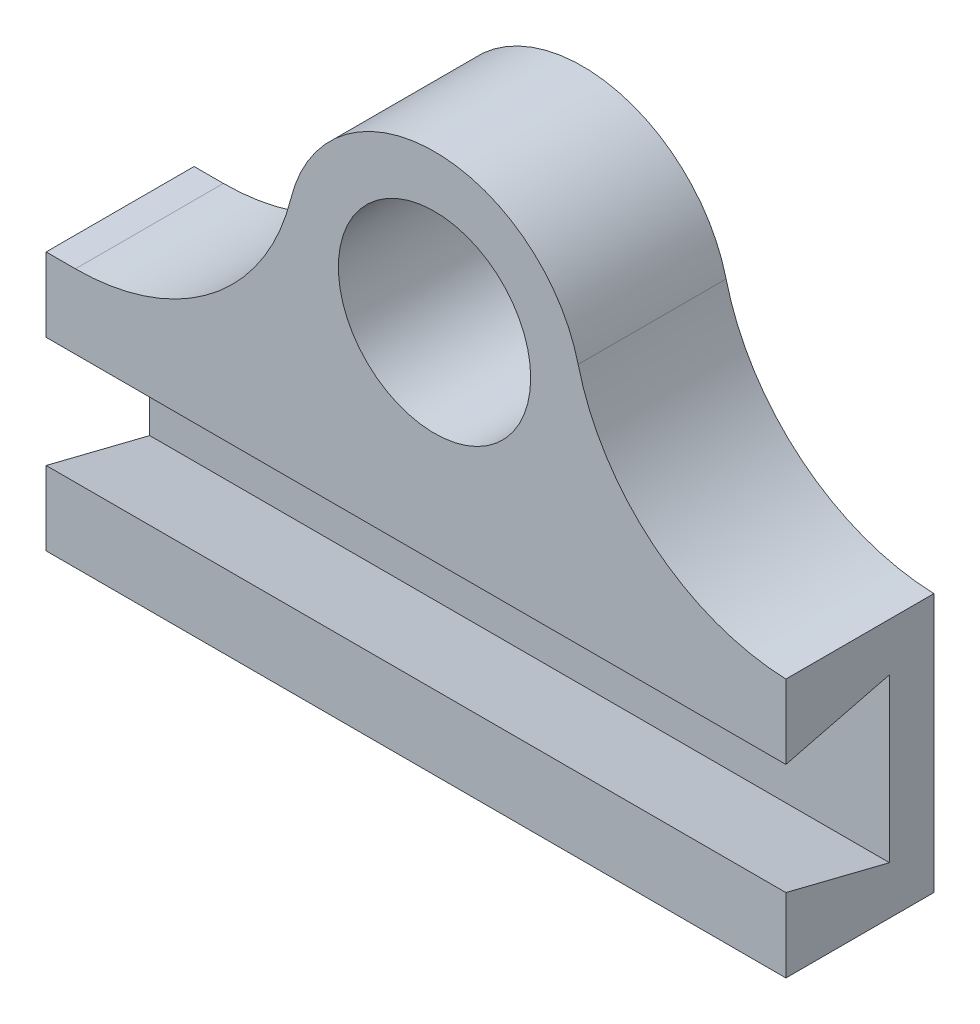
ISO-10303-21;
HEADER;
FILE_DESCRIPTION(('STEP AP214'),'2;1');
FILE_NAME('part.step','',(''),(''),'','','');
FILE_SCHEMA(('AUTOMOTIVE_DESIGN { 1 0 10303 214 1 1 1 1 }'));
ENDSEC;
DATA;
#1=APPLICATION_CONTEXT('core data for automotive mechanical design processes');
#2=APPLICATION_PROTOCOL_DEFINITION('international standard','automotive_design',2000,#1);
#3=PRODUCT_CONTEXT('',#1,'mechanical');
#4=PRODUCT('Part','Part','',(#3));
#5=PRODUCT_RELATED_PRODUCT_CATEGORY('part','',(#4));
#6=PRODUCT_DEFINITION_FORMATION('','',#4);
#7=PRODUCT_DEFINITION_CONTEXT('part definition',#1,'design');
#8=PRODUCT_DEFINITION('design','',#6,#7);
#9=PRODUCT_DEFINITION_SHAPE('','',#8);
#10=(LENGTH_UNIT() NAMED_UNIT(*) SI_UNIT(.MILLI.,.METRE.));
#11=(NAMED_UNIT(*) PLANE_ANGLE_UNIT() SI_UNIT($,.RADIAN.));
#12=(NAMED_UNIT(*) SI_UNIT($,.STERADIAN.) SOLID_ANGLE_UNIT());
#13=UNCERTAINTY_MEASURE_WITH_UNIT(LENGTH_MEASURE(1.E-05),#10,'distance_accuracy_value','');
#14=(GEOMETRIC_REPRESENTATION_CONTEXT(3) GLOBAL_UNCERTAINTY_ASSIGNED_CONTEXT((#13)) GLOBAL_UNIT_ASSIGNED_CONTEXT((#10,
#11,#12)) REPRESENTATION_CONTEXT('',''));
#15=CARTESIAN_POINT('',(0.,0.,0.));
#16=DIRECTION('',(0.,0.,1.));
#17=DIRECTION('',(1.,0.,0.));
#18=AXIS2_PLACEMENT_3D('',#15,#16,#17);
#19=CARTESIAN_POINT('',(-61.0134159180916,-22.5826380371425,2.));
#20=DIRECTION('',(0.,-1.,0.));
#21=DIRECTION('',(1.,0.,0.));
#22=AXIS2_PLACEMENT_3D('',#19,#20,#21);
#23=PLANE('',#22);
#24=DIRECTION('',(-1.,0.,0.));
#25=VECTOR('',#24,1.);
#26=CARTESIAN_POINT('',(-61.0134159180916,-22.5826380371425,2.));
#27=LINE('',#26,#25);
#28=CARTESIAN_POINT('',(-70.6172803578962,-22.5826380371425,2.));
#29=VERTEX_POINT('',#28);
#30=CARTESIAN_POINT('',(-71.0134159180916,-22.5826380371425,2.));
#31=VERTEX_POINT('',#30);
#32=EDGE_CURVE('E222',#29,#31,#27,.T.);
#33=ORIENTED_EDGE('',*,*,#32,.F.);
#34=DIRECTION('',(0.,0.,1.));
#35=VECTOR('',#34,1.);
#36=CARTESIAN_POINT('',(-70.6172803578962,-22.5826380371425,2.));
#37=LINE('',#36,#35);
#38=CARTESIAN_POINT('',(-70.6172803578962,-22.5826380371425,0.));
#39=VERTEX_POINT('',#38);
#40=EDGE_CURVE('E254',#29,#39,#37,.F.);
#41=ORIENTED_EDGE('',*,*,#40,.T.);
#42=DIRECTION('',(-1.,0.,0.));
#43=VECTOR('',#42,1.);
#44=CARTESIAN_POINT('',(-61.0134159180916,-22.5826380371425,0.));
#45=LINE('',#44,#43);
#46=CARTESIAN_POINT('',(-71.0134159180916,-22.5826380371425,0.));
#47=VERTEX_POINT('',#46);
#48=EDGE_CURVE('E235',#39,#47,#45,.T.);
#49=ORIENTED_EDGE('',*,*,#48,.T.);
#50=DIRECTION('',(0.,0.,-1.));
#51=VECTOR('',#50,1.);
#52=CARTESIAN_POINT('',(-71.0134159180916,-22.5826380371425,2.));
#53=LINE('',#52,#51);
#54=EDGE_CURVE('E240',#31,#47,#53,.T.);
#55=ORIENTED_EDGE('',*,*,#54,.F.);
#56=EDGE_LOOP('',(#33,#41,#49,#55));
#57=FACE_BOUND('',#56,.T.);
#58=ADVANCED_FACE('F34',(#57),#23,.F.);
#59=CARTESIAN_POINT('',(0.,0.,0.));
#60=DIRECTION('',(0.,0.,-1.));
#61=DIRECTION('',(-1.,0.,0.));
#62=AXIS2_PLACEMENT_3D('',#59,#60,#61);
#63=PLANE('',#62);
#64=CARTESIAN_POINT('',(-67.5134159180916,-22.5826380371425,0.));
#65=VERTEX_POINT('',#64);
#66=EDGE_CURVE('E49',#65,#39,#45,.T.);
#67=ORIENTED_EDGE('',*,*,#66,.F.);
#68=DIRECTION('',(0.,-1.,0.));
#69=VECTOR('',#68,1.);
#70=CARTESIAN_POINT('',(-67.5134159180916,-22.5826380371425,0.));
#71=LINE('',#70,#69);
#72=CARTESIAN_POINT('',(-67.5134159180916,-26.0826380371425,0.));
#73=VERTEX_POINT('',#72);
#74=EDGE_CURVE('E158',#65,#73,#71,.T.);
#75=ORIENTED_EDGE('',*,*,#74,.T.);
#76=DIRECTION('',(1.,0.,0.));
#77=VECTOR('',#76,1.);
#78=CARTESIAN_POINT('',(-61.0134159180916,-26.0826380371425,0.));
#79=LINE('',#78,#77);
#80=CARTESIAN_POINT('',(-71.0134159180916,-26.0826380371425,0.));
#81=VERTEX_POINT('',#80);
#82=EDGE_CURVE('E229',#81,#73,#79,.T.);
#83=ORIENTED_EDGE('',*,*,#82,.F.);
#84=DIRECTION('',(0.,-1.,0.));
#85=VECTOR('',#84,1.);
#86=CARTESIAN_POINT('',(-71.0134159180916,-26.0826380371425,0.));
#87=LINE('',#86,#85);
#88=EDGE_CURVE('E218',#47,#81,#87,.T.);
#89=ORIENTED_EDGE('',*,*,#88,.F.);
#90=ORIENTED_EDGE('',*,*,#48,.F.);
#91=EDGE_LOOP('',(#67,#75,#83,#89,#90));
#92=FACE_BOUND('',#91,.T.);
#93=ADVANCED_FACE('F284',(#92),#63,.T.);
#94=CARTESIAN_POINT('',(0.,0.,2.));
#95=DIRECTION('',(0.,0.,-1.));
#96=DIRECTION('',(-1.,0.,0.));
#97=AXIS2_PLACEMENT_3D('',#94,#95,#96);
#98=PLANE('',#97);
#99=DIRECTION('',(0.,1.,0.));
#100=VECTOR('',#99,1.);
#101=CARTESIAN_POINT('',(-61.0134159180916,-26.0826380371425,2.));
#102=LINE('',#101,#100);
#103=CARTESIAN_POINT('',(-61.0134159180916,-26.0826380371425,2.));
#104=VERTEX_POINT('',#103);
#105=CARTESIAN_POINT('',(-61.0134159180916,-25.0826380371425,2.));
#106=VERTEX_POINT('',#105);
#107=EDGE_CURVE('E219',#104,#106,#102,.T.);
#108=ORIENTED_EDGE('',*,*,#107,.T.);
#109=DIRECTION('',(-1.,0.,0.));
#110=VECTOR('',#109,1.);
#111=CARTESIAN_POINT('',(-61.0134159180916,-25.0826380371425,2.));
#112=LINE('',#111,#110);
#113=CARTESIAN_POINT('',(-71.0134159180916,-25.0826380371425,2.));
#114=VERTEX_POINT('',#113);
#115=EDGE_CURVE('E199',#106,#114,#112,.T.);
#116=ORIENTED_EDGE('',*,*,#115,.T.);
#117=DIRECTION('',(0.,-1.,0.));
#118=VECTOR('',#117,1.);
#119=CARTESIAN_POINT('',(-71.0134159180916,-26.0826380371425,2.));
#120=LINE('',#119,#118);
#121=CARTESIAN_POINT('',(-71.0134159180916,-26.0826380371425,2.));
#122=VERTEX_POINT('',#121);
#123=EDGE_CURVE('E224',#114,#122,#120,.T.);
#124=ORIENTED_EDGE('',*,*,#123,.T.);
#125=DIRECTION('',(1.,0.,0.));
#126=VECTOR('',#125,1.);
#127=CARTESIAN_POINT('',(-61.0134159180916,-26.0826380371425,2.));
#128=LINE('',#127,#126);
#129=EDGE_CURVE('E214',#122,#104,#128,.T.);
#130=ORIENTED_EDGE('',*,*,#129,.T.);
#131=EDGE_LOOP('',(#108,#116,#124,#130));
#132=FACE_BOUND('',#131,.T.);
#133=ADVANCED_FACE('F310',(#132),#98,.F.);
#134=CARTESIAN_POINT('',(-61.0134159180916,-26.0826380371425,2.));
#135=DIRECTION('',(0.,1.,0.));
#136=DIRECTION('',(-1.,0.,0.));
#137=AXIS2_PLACEMENT_3D('',#134,#135,#136);
#138=PLANE('',#137);
#139=ORIENTED_EDGE('',*,*,#82,.T.);
#140=DIRECTION('',(-0.263117405792104,0.,-0.964763821237733));
#141=VECTOR('',#140,1.);
#142=CARTESIAN_POINT('',(-67.8134159180916,-26.0826380371425,-1.1));
#143=LINE('',#142,#141);
#144=CARTESIAN_POINT('',(-67.8134159180916,-26.0826380371425,-1.1));
#145=VERTEX_POINT('',#144);
#146=EDGE_CURVE('E165',#73,#145,#143,.T.);
#147=ORIENTED_EDGE('',*,*,#146,.T.);
#148=DIRECTION('',(1.,0.,0.));
#149=VECTOR('',#148,1.);
#150=CARTESIAN_POINT('',(-66.2134159180916,-26.0826380371425,-1.1));
#151=LINE('',#150,#149);
#152=CARTESIAN_POINT('',(-66.2134159180916,-26.0826380371425,-1.1));
#153=VERTEX_POINT('',#152);
#154=EDGE_CURVE('E169',#145,#153,#151,.T.);
#155=ORIENTED_EDGE('',*,*,#154,.T.);
#156=DIRECTION('',(-0.263117405792104,0.,0.964763821237733));
#157=VECTOR('',#156,1.);
#158=CARTESIAN_POINT('',(-66.5134159180916,-26.0826380371425,0.));
#159=LINE('',#158,#157);
#160=CARTESIAN_POINT('',(-66.5134159180916,-26.0826380371425,0.));
#161=VERTEX_POINT('',#160);
#162=EDGE_CURVE('E179',#153,#161,#159,.T.);
#163=ORIENTED_EDGE('',*,*,#162,.T.);
#164=CARTESIAN_POINT('',(-61.0134159180916,-26.0826380371425,0.));
#165=VERTEX_POINT('',#164);
#166=EDGE_CURVE('E145',#161,#165,#79,.T.);
#167=ORIENTED_EDGE('',*,*,#166,.T.);
#168=DIRECTION('',(0.,0.,-1.));
#169=VECTOR('',#168,1.);
#170=CARTESIAN_POINT('',(-61.0134159180916,-26.0826380371425,2.));
#171=LINE('',#170,#169);
#172=EDGE_CURVE('E246',#104,#165,#171,.T.);
#173=ORIENTED_EDGE('',*,*,#172,.F.);
#174=ORIENTED_EDGE('',*,*,#129,.F.);
#175=DIRECTION('',(0.,0.,-1.));
#176=VECTOR('',#175,1.);
#177=CARTESIAN_POINT('',(-71.0134159180916,-26.0826380371425,2.));
#178=LINE('',#177,#176);
#179=EDGE_CURVE('E228',#122,#81,#178,.T.);
#180=ORIENTED_EDGE('',*,*,#179,.T.);
#181=EDGE_LOOP('',(#139,#147,#155,#163,#167,#173,#174,#180));
#182=FACE_BOUND('',#181,.T.);
#183=ADVANCED_FACE('F276',(#182),#138,.F.);
#184=CARTESIAN_POINT('',(-61.0134159180916,-26.0826380371425,2.));
#185=DIRECTION('',(-1.,0.,0.));
#186=DIRECTION('',(0.,0.,1.));
#187=AXIS2_PLACEMENT_3D('',#184,#185,#186);
#188=PLANE('',#187);
#189=DIRECTION('',(0.,-1.,0.));
#190=VECTOR('',#189,1.);
#191=CARTESIAN_POINT('',(-61.0134159180916,-25.4326380371425,0.6));
#192=LINE('',#191,#190);
#193=CARTESIAN_POINT('',(-61.0134159180916,-23.2326380371425,0.599999999999999));
#194=VERTEX_POINT('',#193);
#195=CARTESIAN_POINT('',(-61.0134159180916,-25.4326380371425,0.6));
#196=VERTEX_POINT('',#195);
#197=EDGE_CURVE('E196',#194,#196,#192,.T.);
#198=ORIENTED_EDGE('',*,*,#197,.T.);
#199=DIRECTION('',(0.,0.242535625036333,0.970142500145332));
#200=VECTOR('',#199,1.);
#201=CARTESIAN_POINT('',(-61.0134159180916,-25.0826380371425,2.));
#202=LINE('',#201,#200);
#203=EDGE_CURVE('E189',#196,#106,#202,.T.);
#204=ORIENTED_EDGE('',*,*,#203,.T.);
#205=ORIENTED_EDGE('',*,*,#107,.F.);
#206=ORIENTED_EDGE('',*,*,#172,.T.);
#207=DIRECTION('',(0.,1.,0.));
#208=VECTOR('',#207,1.);
#209=CARTESIAN_POINT('',(-61.0134159180916,-26.0826380371425,0.));
#210=LINE('',#209,#208);
#211=CARTESIAN_POINT('',(-61.0134159180916,-22.5826380371425,0.));
#212=VERTEX_POINT('',#211);
#213=EDGE_CURVE('E232',#165,#212,#210,.T.);
#214=ORIENTED_EDGE('',*,*,#213,.T.);
#215=DIRECTION('',(0.,0.,-1.));
#216=VECTOR('',#215,1.);
#217=CARTESIAN_POINT('',(-61.0134159180916,-22.5826380371425,2.));
#218=LINE('',#217,#216);
#219=CARTESIAN_POINT('',(-61.0134159180916,-22.5826380371425,2.));
#220=VERTEX_POINT('',#219);
#221=EDGE_CURVE('E243',#220,#212,#218,.T.);
#222=ORIENTED_EDGE('',*,*,#221,.F.);
#223=CARTESIAN_POINT('',(-61.0134159180916,-23.5826380371425,2.));
#224=VERTEX_POINT('',#223);
#225=EDGE_CURVE('E217',#224,#220,#102,.T.);
#226=ORIENTED_EDGE('',*,*,#225,.F.);
#227=DIRECTION('',(0.,0.242535625036333,-0.970142500145332));
#228=VECTOR('',#227,1.);
#229=CARTESIAN_POINT('',(-61.0134159180916,-23.2326380371425,0.599999999999999));
#230=LINE('',#229,#228);
#231=EDGE_CURVE('E192',#224,#194,#230,.T.);
#232=ORIENTED_EDGE('',*,*,#231,.T.);
#233=EDGE_LOOP('',(#198,#204,#205,#206,#214,#222,#226,#232));
#234=FACE_BOUND('',#233,.T.);
#235=ADVANCED_FACE('F272',(#234),#188,.F.);
#236=DIRECTION('',(-0.263117405792104,0.,-0.964763821237733));
#237=VECTOR('',#236,1.);
#238=CARTESIAN_POINT('',(-67.8134159180916,-22.5826380371425,-1.1));
#239=LINE('',#238,#237);
#240=CARTESIAN_POINT('',(-67.8134159180916,-22.5826380371425,-1.1));
#241=VERTEX_POINT('',#240);
#242=EDGE_CURVE('E164',#65,#241,#239,.T.);
#243=ORIENTED_EDGE('',*,*,#242,.F.);
#244=DIRECTION('',(1.,0.,0.));
#245=VECTOR('',#244,1.);
#246=CARTESIAN_POINT('',(-64.8916361293835,-22.5826380371425,0.));
#247=LINE('',#246,#245);
#248=CARTESIAN_POINT('',(-66.5134159180916,-22.5826380371425,0.));
#249=VERTEX_POINT('',#248);
#250=EDGE_CURVE('E142',#65,#249,#247,.T.);
#251=ORIENTED_EDGE('',*,*,#250,.T.);
#252=DIRECTION('',(-0.263117405792104,0.,0.964763821237733));
#253=VECTOR('',#252,1.);
#254=CARTESIAN_POINT('',(-66.5134159180916,-22.5826380371425,0.));
#255=LINE('',#254,#253);
#256=CARTESIAN_POINT('',(-66.2134159180916,-22.5826380371425,-1.1));
#257=VERTEX_POINT('',#256);
#258=EDGE_CURVE('E153',#257,#249,#255,.T.);
#259=ORIENTED_EDGE('',*,*,#258,.F.);
#260=DIRECTION('',(1.,0.,0.));
#261=VECTOR('',#260,1.);
#262=CARTESIAN_POINT('',(-66.2134159180916,-22.5826380371425,-1.1));
#263=LINE('',#262,#261);
#264=EDGE_CURVE('E159',#241,#257,#263,.T.);
#265=ORIENTED_EDGE('',*,*,#264,.F.);
#266=EDGE_LOOP('',(#243,#251,#259,#265));
#267=FACE_BOUND('',#266,.T.);
#268=ADVANCED_FACE('F162',(#267),#23,.F.);
#269=CARTESIAN_POINT('',(-71.0134159180916,-26.0826380371425,2.));
#270=DIRECTION('',(1.,0.,0.));
#271=DIRECTION('',(0.,0.,-1.));
#272=AXIS2_PLACEMENT_3D('',#269,#270,#271);
#273=PLANE('',#272);
#274=ORIENTED_EDGE('',*,*,#123,.F.);
#275=DIRECTION('',(0.,0.242535625036333,0.970142500145332));
#276=VECTOR('',#275,1.);
#277=CARTESIAN_POINT('',(-71.0134159180916,-25.0826380371425,2.));
#278=LINE('',#277,#276);
#279=CARTESIAN_POINT('',(-71.0134159180916,-25.4326380371425,0.6));
#280=VERTEX_POINT('',#279);
#281=EDGE_CURVE('E149',#280,#114,#278,.T.);
#282=ORIENTED_EDGE('',*,*,#281,.F.);
#283=DIRECTION('',(0.,-1.,0.));
#284=VECTOR('',#283,1.);
#285=CARTESIAN_POINT('',(-71.0134159180916,-25.4326380371425,0.6));
#286=LINE('',#285,#284);
#287=CARTESIAN_POINT('',(-71.0134159180916,-23.2326380371425,0.599999999999999));
#288=VERTEX_POINT('',#287);
#289=EDGE_CURVE('E193',#288,#280,#286,.T.);
#290=ORIENTED_EDGE('',*,*,#289,.F.);
#291=DIRECTION('',(0.,0.242535625036333,-0.970142500145332));
#292=VECTOR('',#291,1.);
#293=CARTESIAN_POINT('',(-71.0134159180916,-23.2326380371425,0.599999999999999));
#294=LINE('',#293,#292);
#295=CARTESIAN_POINT('',(-71.0134159180916,-23.5826380371425,2.));
#296=VERTEX_POINT('',#295);
#297=EDGE_CURVE('E201',#296,#288,#294,.T.);
#298=ORIENTED_EDGE('',*,*,#297,.F.);
#299=EDGE_CURVE('E225',#31,#296,#120,.T.);
#300=ORIENTED_EDGE('',*,*,#299,.F.);
#301=ORIENTED_EDGE('',*,*,#54,.T.);
#302=ORIENTED_EDGE('',*,*,#88,.T.);
#303=ORIENTED_EDGE('',*,*,#179,.F.);
#304=EDGE_LOOP('',(#274,#282,#290,#298,#300,#301,#302,#303));
#305=FACE_BOUND('',#304,.T.);
#306=ADVANCED_FACE('F290',(#305),#273,.F.);
#307=CARTESIAN_POINT('',(-65.7634159180916,-20.7826380371425,2.));
#308=DIRECTION('',(0.,0.,1.));
#309=DIRECTION('',(1.,0.,0.));
#310=AXIS2_PLACEMENT_3D('',#307,#308,#309);
#311=CIRCLE('',#310,1.29999999999999);
#312=CARTESIAN_POINT('',(-64.4634159180916,-20.7826380371425,2.));
#313=VERTEX_POINT('',#312);
#314=EDGE_CURVE('E177',#313,#313,#311,.T.);
#315=ORIENTED_EDGE('',*,*,#314,.F.);
#316=EDGE_LOOP('',(#315));
#317=FACE_BOUND('',#316,.T.);
#318=ORIENTED_EDGE('',*,*,#299,.T.);
#319=DIRECTION('',(-1.,0.,0.));
#320=VECTOR('',#319,1.);
#321=CARTESIAN_POINT('',(-61.0134159180916,-23.5826380371425,2.));
#322=LINE('',#321,#320);
#323=EDGE_CURVE('E210',#224,#296,#322,.T.);
#324=ORIENTED_EDGE('',*,*,#323,.F.);
#325=ORIENTED_EDGE('',*,*,#225,.T.);
#326=CARTESIAN_POINT('',(-60.9091033539989,-19.5844521041203,2.));
#327=DIRECTION('',(0.,0.,-1.));
#328=DIRECTION('',(-1.,0.,0.));
#329=AXIS2_PLACEMENT_3D('',#326,#327,#328);
#330=CIRCLE('',#329,3.);
#331=CARTESIAN_POINT('',(-63.8216908924545,-20.3033636639336,2.));
#332=VERTEX_POINT('',#331);
#333=EDGE_CURVE('E42',#220,#332,#330,.T.);
#334=ORIENTED_EDGE('',*,*,#333,.T.);
#335=CARTESIAN_POINT('',(-65.7634159180916,-20.7826380371425,2.));
#336=DIRECTION('',(0.,0.,1.));
#337=DIRECTION('',(1.,0.,0.));
#338=AXIS2_PLACEMENT_3D('',#335,#336,#337);
#339=CIRCLE('',#338,2.);
#340=CARTESIAN_POINT('',(-67.7049616940134,-20.3026380371425,2.));
#341=VERTEX_POINT('',#340);
#342=EDGE_CURVE('E172',#332,#341,#339,.T.);
#343=ORIENTED_EDGE('',*,*,#342,.T.);
#344=CARTESIAN_POINT('',(-70.6172803578962,-19.5826380371425,2.));
#345=DIRECTION('',(0.,0.,-1.));
#346=DIRECTION('',(-1.,0.,0.));
#347=AXIS2_PLACEMENT_3D('',#344,#345,#346);
#348=CIRCLE('',#347,3.);
#349=EDGE_CURVE('E57',#341,#29,#348,.T.);
#350=ORIENTED_EDGE('',*,*,#349,.T.);
#351=ORIENTED_EDGE('',*,*,#32,.T.);
#352=EDGE_LOOP('',(#318,#324,#325,#334,#343,#350,#351));
#353=FACE_BOUND('',#352,.T.);
#354=ADVANCED_FACE('F260',(#317,#353),#98,.F.);
#355=CARTESIAN_POINT('',(-65.7634159180916,-20.7826380371425,0.));
#356=DIRECTION('',(0.,0.,-1.));
#357=DIRECTION('',(-1.,0.,0.));
#358=AXIS2_PLACEMENT_3D('',#355,#356,#357);
#359=CIRCLE('',#358,1.29999999999999);
#360=CARTESIAN_POINT('',(-67.0634159180916,-20.7826380371425,0.));
#361=VERTEX_POINT('',#360);
#362=EDGE_CURVE('E367',#361,#361,#359,.F.);
#363=ORIENTED_EDGE('',*,*,#362,.T.);
#364=EDGE_LOOP('',(#363));
#365=FACE_BOUND('',#364,.T.);
#366=DIRECTION('',(0.,-1.,0.));
#367=VECTOR('',#366,1.);
#368=CARTESIAN_POINT('',(-66.5134159180916,-22.5826380371425,0.));
#369=LINE('',#368,#367);
#370=EDGE_CURVE('E138',#249,#161,#369,.T.);
#371=ORIENTED_EDGE('',*,*,#370,.F.);
#372=ORIENTED_EDGE('',*,*,#250,.F.);
#373=ORIENTED_EDGE('',*,*,#66,.T.);
#374=CARTESIAN_POINT('',(-70.6172803578962,-19.5826380371425,0.));
#375=DIRECTION('',(0.,0.,-1.));
#376=DIRECTION('',(-1.,0.,0.));
#377=AXIS2_PLACEMENT_3D('',#374,#375,#376);
#378=CIRCLE('',#377,3.);
#379=CARTESIAN_POINT('',(-67.7049616940134,-20.3026380371425,0.));
#380=VERTEX_POINT('',#379);
#381=EDGE_CURVE('E257',#39,#380,#378,.F.);
#382=ORIENTED_EDGE('',*,*,#381,.T.);
#383=CARTESIAN_POINT('',(-65.7634159180916,-20.7826380371425,0.));
#384=DIRECTION('',(0.,0.,1.));
#385=DIRECTION('',(1.,0.,0.));
#386=AXIS2_PLACEMENT_3D('',#383,#384,#385);
#387=CIRCLE('',#386,2.);
#388=CARTESIAN_POINT('',(-63.8216908924545,-20.3033636639336,0.));
#389=VERTEX_POINT('',#388);
#390=EDGE_CURVE('E166',#389,#380,#387,.T.);
#391=ORIENTED_EDGE('',*,*,#390,.F.);
#392=CARTESIAN_POINT('',(-60.9091033539989,-19.5844521041203,0.));
#393=DIRECTION('',(0.,0.,-1.));
#394=DIRECTION('',(-1.,0.,0.));
#395=AXIS2_PLACEMENT_3D('',#392,#393,#394);
#396=CIRCLE('',#395,3.);
#397=EDGE_CURVE('E11',#389,#212,#396,.F.);
#398=ORIENTED_EDGE('',*,*,#397,.T.);
#399=ORIENTED_EDGE('',*,*,#213,.F.);
#400=ORIENTED_EDGE('',*,*,#166,.F.);
#401=EDGE_LOOP('',(#371,#372,#373,#382,#391,#398,#399,#400));
#402=FACE_BOUND('',#401,.T.);
#403=ADVANCED_FACE('F140',(#365,#402),#63,.T.);
#404=CARTESIAN_POINT('',(-61.0134159180916,-25.0826380371425,2.));
#405=DIRECTION('',(0.,-0.970142500145332,0.242535625036333));
#406=DIRECTION('',(0.,-0.242535625036333,-0.970142500145332));
#407=AXIS2_PLACEMENT_3D('',#404,#405,#406);
#408=PLANE('',#407);
#409=ORIENTED_EDGE('',*,*,#281,.T.);
#410=ORIENTED_EDGE('',*,*,#115,.F.);
#411=ORIENTED_EDGE('',*,*,#203,.F.);
#412=DIRECTION('',(-1.,0.,0.));
#413=VECTOR('',#412,1.);
#414=CARTESIAN_POINT('',(-61.0134159180916,-25.4326380371425,0.6));
#415=LINE('',#414,#413);
#416=EDGE_CURVE('E206',#196,#280,#415,.T.);
#417=ORIENTED_EDGE('',*,*,#416,.T.);
#418=EDGE_LOOP('',(#409,#410,#411,#417));
#419=FACE_BOUND('',#418,.T.);
#420=ADVANCED_FACE('F308',(#419),#408,.F.);
#421=CARTESIAN_POINT('',(-61.0134159180916,-25.4326380371425,0.6));
#422=DIRECTION('',(0.,0.,-1.));
#423=DIRECTION('',(0.,1.,0.));
#424=AXIS2_PLACEMENT_3D('',#421,#422,#423);
#425=PLANE('',#424);
#426=ORIENTED_EDGE('',*,*,#289,.T.);
#427=ORIENTED_EDGE('',*,*,#416,.F.);
#428=ORIENTED_EDGE('',*,*,#197,.F.);
#429=DIRECTION('',(-1.,0.,0.));
#430=VECTOR('',#429,1.);
#431=CARTESIAN_POINT('',(-61.0134159180916,-23.2326380371425,0.599999999999999));
#432=LINE('',#431,#430);
#433=EDGE_CURVE('E208',#194,#288,#432,.T.);
#434=ORIENTED_EDGE('',*,*,#433,.T.);
#435=EDGE_LOOP('',(#426,#427,#428,#434));
#436=FACE_BOUND('',#435,.T.);
#437=ADVANCED_FACE('F306',(#436),#425,.F.);
#438=CARTESIAN_POINT('',(-61.0134159180916,-23.2326380371425,0.599999999999999));
#439=DIRECTION('',(0.,0.970142500145332,0.242535625036333));
#440=DIRECTION('',(0.,-0.242535625036333,0.970142500145332));
#441=AXIS2_PLACEMENT_3D('',#438,#439,#440);
#442=PLANE('',#441);
#443=ORIENTED_EDGE('',*,*,#297,.T.);
#444=ORIENTED_EDGE('',*,*,#433,.F.);
#445=ORIENTED_EDGE('',*,*,#231,.F.);
#446=ORIENTED_EDGE('',*,*,#323,.T.);
#447=EDGE_LOOP('',(#443,#444,#445,#446));
#448=FACE_BOUND('',#447,.T.);
#449=ADVANCED_FACE('F302',(#448),#442,.F.);
#450=CARTESIAN_POINT('',(-66.5134159180916,-22.5826380371425,0.));
#451=DIRECTION('',(0.964763821237733,0.,0.263117405792104));
#452=DIRECTION('',(0.263117405792104,0.,-0.964763821237733));
#453=AXIS2_PLACEMENT_3D('',#450,#451,#452);
#454=PLANE('',#453);
#455=ORIENTED_EDGE('',*,*,#162,.F.);
#456=DIRECTION('',(0.,-1.,0.));
#457=VECTOR('',#456,1.);
#458=CARTESIAN_POINT('',(-66.2134159180916,-22.5826380371425,-1.1));
#459=LINE('',#458,#457);
#460=EDGE_CURVE('E150',#257,#153,#459,.T.);
#461=ORIENTED_EDGE('',*,*,#460,.F.);
#462=ORIENTED_EDGE('',*,*,#258,.T.);
#463=ORIENTED_EDGE('',*,*,#370,.T.);
#464=EDGE_LOOP('',(#455,#461,#462,#463));
#465=FACE_BOUND('',#464,.T.);
#466=ADVANCED_FACE('F154',(#465),#454,.T.);
#467=CARTESIAN_POINT('',(-66.2134159180916,-22.5826380371425,-1.1));
#468=DIRECTION('',(0.,0.,-1.));
#469=DIRECTION('',(-1.,0.,0.));
#470=AXIS2_PLACEMENT_3D('',#467,#468,#469);
#471=PLANE('',#470);
#472=ORIENTED_EDGE('',*,*,#154,.F.);
#473=DIRECTION('',(0.,-1.,0.));
#474=VECTOR('',#473,1.);
#475=CARTESIAN_POINT('',(-67.8134159180916,-22.5826380371425,-1.1));
#476=LINE('',#475,#474);
#477=EDGE_CURVE('E185',#241,#145,#476,.T.);
#478=ORIENTED_EDGE('',*,*,#477,.F.);
#479=ORIENTED_EDGE('',*,*,#264,.T.);
#480=ORIENTED_EDGE('',*,*,#460,.T.);
#481=EDGE_LOOP('',(#472,#478,#479,#480));
#482=FACE_BOUND('',#481,.T.);
#483=ADVANCED_FACE('F279',(#482),#471,.T.);
#484=CARTESIAN_POINT('',(-67.8134159180916,-22.5826380371425,-1.1));
#485=DIRECTION('',(-0.964763821237733,0.,0.263117405792104));
#486=DIRECTION('',(0.263117405792104,0.,0.964763821237733));
#487=AXIS2_PLACEMENT_3D('',#484,#485,#486);
#488=PLANE('',#487);
#489=ORIENTED_EDGE('',*,*,#146,.F.);
#490=ORIENTED_EDGE('',*,*,#74,.F.);
#491=ORIENTED_EDGE('',*,*,#242,.T.);
#492=ORIENTED_EDGE('',*,*,#477,.T.);
#493=EDGE_LOOP('',(#489,#490,#491,#492));
#494=FACE_BOUND('',#493,.T.);
#495=ADVANCED_FACE('F281',(#494),#488,.T.);
#496=CARTESIAN_POINT('',(-65.7634159180916,-20.7826380371425,0.));
#497=DIRECTION('',(0.,0.,1.));
#498=DIRECTION('',(1.,0.,0.));
#499=AXIS2_PLACEMENT_3D('',#496,#497,#498);
#500=CYLINDRICAL_SURFACE('',#499,2.);
#501=ORIENTED_EDGE('',*,*,#390,.T.);
#502=DIRECTION('',(0.,0.,1.));
#503=VECTOR('',#502,1.);
#504=CARTESIAN_POINT('',(-67.7049616940134,-20.3026380371425,0.));
#505=LINE('',#504,#503);
#506=EDGE_CURVE('E251',#380,#341,#505,.T.);
#507=ORIENTED_EDGE('',*,*,#506,.T.);
#508=ORIENTED_EDGE('',*,*,#342,.F.);
#509=DIRECTION('',(0.,0.,1.));
#510=VECTOR('',#509,1.);
#511=CARTESIAN_POINT('',(-63.8216908924545,-20.3033636639336,0.));
#512=LINE('',#511,#510);
#513=EDGE_CURVE('E249',#332,#389,#512,.F.);
#514=ORIENTED_EDGE('',*,*,#513,.T.);
#515=EDGE_LOOP('',(#501,#507,#508,#514));
#516=FACE_BOUND('',#515,.T.);
#517=ADVANCED_FACE('F267',(#516),#500,.T.);
#518=CARTESIAN_POINT('',(-65.7634159180916,-20.7826380371425,-1.101));
#519=DIRECTION('',(0.,0.,1.));
#520=DIRECTION('',(1.,0.,0.));
#521=AXIS2_PLACEMENT_3D('',#518,#519,#520);
#522=CYLINDRICAL_SURFACE('',#521,1.29999999999999);
#523=ORIENTED_EDGE('',*,*,#362,.F.);
#524=EDGE_LOOP('',(#523));
#525=FACE_BOUND('',#524,.T.);
#526=ORIENTED_EDGE('',*,*,#314,.T.);
#527=EDGE_LOOP('',(#526));
#528=FACE_BOUND('',#527,.T.);
#529=ADVANCED_FACE('F336',(#525,#528),#522,.F.);
#530=CARTESIAN_POINT('',(-70.6172803578962,-19.5826380371425,0.));
#531=DIRECTION('',(0.,0.,1.));
#532=DIRECTION('',(1.,0.,0.));
#533=AXIS2_PLACEMENT_3D('',#530,#531,#532);
#534=CYLINDRICAL_SURFACE('',#533,3.);
#535=ORIENTED_EDGE('',*,*,#381,.F.);
#536=ORIENTED_EDGE('',*,*,#40,.F.);
#537=ORIENTED_EDGE('',*,*,#349,.F.);
#538=ORIENTED_EDGE('',*,*,#506,.F.);
#539=EDGE_LOOP('',(#535,#536,#537,#538));
#540=FACE_BOUND('',#539,.T.);
#541=ADVANCED_FACE('F298',(#540),#534,.F.);
#542=CARTESIAN_POINT('',(-60.9091033539989,-19.5844521041203,0.));
#543=DIRECTION('',(0.,0.,-1.));
#544=DIRECTION('',(-1.,0.,0.));
#545=AXIS2_PLACEMENT_3D('',#542,#543,#544);
#546=CYLINDRICAL_SURFACE('',#545,3.);
#547=ORIENTED_EDGE('',*,*,#397,.F.);
#548=ORIENTED_EDGE('',*,*,#513,.F.);
#549=ORIENTED_EDGE('',*,*,#333,.F.);
#550=ORIENTED_EDGE('',*,*,#221,.T.);
#551=EDGE_LOOP('',(#547,#548,#549,#550));
#552=FACE_BOUND('',#551,.T.);
#553=ADVANCED_FACE('F36',(#552),#546,.F.);
#554=CLOSED_SHELL('',(#58,#93,#133,#183,#235,#268,#306,#354,#403,#420,#437,#449,#466,#483,#495,
#517,#529,#541,#553));
#555=MANIFOLD_SOLID_BREP('B2',#554);
#556=ADVANCED_BREP_SHAPE_REPRESENTATION('',(#18,#555),#14);
#557=SHAPE_DEFINITION_REPRESENTATION(#9,#556);
ENDSEC;
END-ISO-10303-21;
